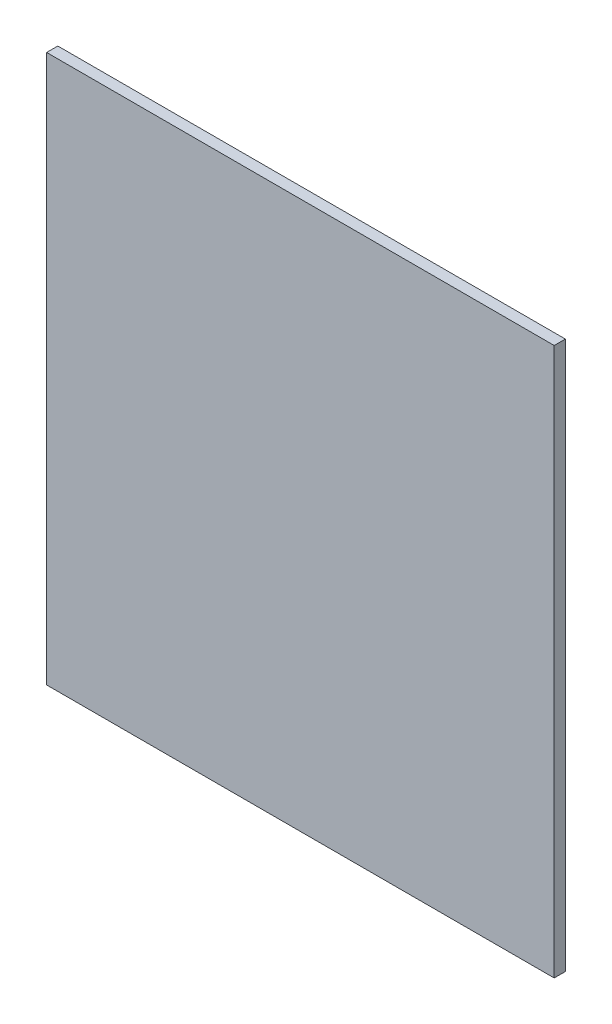
ISO-10303-21;
HEADER;
FILE_DESCRIPTION(('STEP AP214'),'2;1');
FILE_NAME('part.step','',(''),(''),'','','');
FILE_SCHEMA(('AUTOMOTIVE_DESIGN { 1 0 10303 214 1 1 1 1 }'));
ENDSEC;
DATA;
#1=APPLICATION_CONTEXT('core data for automotive mechanical design processes');
#2=APPLICATION_PROTOCOL_DEFINITION('international standard','automotive_design',2000,#1);
#3=PRODUCT_CONTEXT('',#1,'mechanical');
#4=PRODUCT('Part','Part','',(#3));
#5=PRODUCT_RELATED_PRODUCT_CATEGORY('part','',(#4));
#6=PRODUCT_DEFINITION_FORMATION('','',#4);
#7=PRODUCT_DEFINITION_CONTEXT('part definition',#1,'design');
#8=PRODUCT_DEFINITION('design','',#6,#7);
#9=PRODUCT_DEFINITION_SHAPE('','',#8);
#10=(LENGTH_UNIT() NAMED_UNIT(*) SI_UNIT(.MILLI.,.METRE.));
#11=(NAMED_UNIT(*) PLANE_ANGLE_UNIT() SI_UNIT($,.RADIAN.));
#12=(NAMED_UNIT(*) SI_UNIT($,.STERADIAN.) SOLID_ANGLE_UNIT());
#13=UNCERTAINTY_MEASURE_WITH_UNIT(LENGTH_MEASURE(1.E-05),#10,'distance_accuracy_value','');
#14=(GEOMETRIC_REPRESENTATION_CONTEXT(3) GLOBAL_UNCERTAINTY_ASSIGNED_CONTEXT((#13)) GLOBAL_UNIT_ASSIGNED_CONTEXT((#10,
#11,#12)) REPRESENTATION_CONTEXT('',''));
#15=CARTESIAN_POINT('',(0.,0.,0.));
#16=DIRECTION('',(0.,0.,1.));
#17=DIRECTION('',(1.,0.,0.));
#18=AXIS2_PLACEMENT_3D('',#15,#16,#17);
#19=CARTESIAN_POINT('',(-23.,38.3,1.25));
#20=DIRECTION('',(1.,0.,0.));
#21=DIRECTION('',(0.,1.,0.));
#22=AXIS2_PLACEMENT_3D('',#19,#20,#21);
#23=PLANE('',#22);
#24=DIRECTION('',(0.,-1.,0.));
#25=VECTOR('',#24,1.);
#26=CARTESIAN_POINT('',(-23.,38.3,0.));
#27=LINE('',#26,#25);
#28=CARTESIAN_POINT('',(-23.,38.3,0.));
#29=VERTEX_POINT('',#28);
#30=CARTESIAN_POINT('',(-23.,-23.,0.));
#31=VERTEX_POINT('',#30);
#32=EDGE_CURVE('E111',#29,#31,#27,.T.);
#33=ORIENTED_EDGE('',*,*,#32,.T.);
#34=DIRECTION('',(0.,0.,-1.));
#35=VECTOR('',#34,1.);
#36=CARTESIAN_POINT('',(-23.,-23.,1.25));
#37=LINE('',#36,#35);
#38=CARTESIAN_POINT('',(-23.,-23.,1.25));
#39=VERTEX_POINT('',#38);
#40=EDGE_CURVE('E11',#39,#31,#37,.T.);
#41=ORIENTED_EDGE('',*,*,#40,.F.);
#42=DIRECTION('',(0.,-1.,0.));
#43=VECTOR('',#42,1.);
#44=CARTESIAN_POINT('',(-23.,38.3,1.25));
#45=LINE('',#44,#43);
#46=CARTESIAN_POINT('',(-23.,38.3,1.25));
#47=VERTEX_POINT('',#46);
#48=EDGE_CURVE('E95',#47,#39,#45,.T.);
#49=ORIENTED_EDGE('',*,*,#48,.F.);
#50=DIRECTION('',(0.,0.,-1.));
#51=VECTOR('',#50,1.);
#52=CARTESIAN_POINT('',(-23.,38.3,1.25));
#53=LINE('',#52,#51);
#54=EDGE_CURVE('E107',#47,#29,#53,.T.);
#55=ORIENTED_EDGE('',*,*,#54,.T.);
#56=EDGE_LOOP('',(#33,#41,#49,#55));
#57=FACE_BOUND('',#56,.T.);
#58=ADVANCED_FACE('F43',(#57),#23,.F.);
#59=CARTESIAN_POINT('',(-23.,-23.,1.25));
#60=DIRECTION('',(0.,1.,0.));
#61=DIRECTION('',(0.,0.,1.));
#62=AXIS2_PLACEMENT_3D('',#59,#60,#61);
#63=PLANE('',#62);
#64=DIRECTION('',(1.,0.,0.));
#65=VECTOR('',#64,1.);
#66=CARTESIAN_POINT('',(-23.,-23.,0.));
#67=LINE('',#66,#65);
#68=CARTESIAN_POINT('',(33.8,-23.,0.));
#69=VERTEX_POINT('',#68);
#70=EDGE_CURVE('E100',#31,#69,#67,.T.);
#71=ORIENTED_EDGE('',*,*,#70,.T.);
#72=DIRECTION('',(0.,0.,-1.));
#73=VECTOR('',#72,1.);
#74=CARTESIAN_POINT('',(33.8,-23.,1.25));
#75=LINE('',#74,#73);
#76=CARTESIAN_POINT('',(33.8,-23.,1.25));
#77=VERTEX_POINT('',#76);
#78=EDGE_CURVE('E52',#77,#69,#75,.T.);
#79=ORIENTED_EDGE('',*,*,#78,.F.);
#80=DIRECTION('',(1.,0.,0.));
#81=VECTOR('',#80,1.);
#82=CARTESIAN_POINT('',(-23.,-23.,1.25));
#83=LINE('',#82,#81);
#84=EDGE_CURVE('E90',#39,#77,#83,.T.);
#85=ORIENTED_EDGE('',*,*,#84,.F.);
#86=ORIENTED_EDGE('',*,*,#40,.T.);
#87=EDGE_LOOP('',(#71,#79,#85,#86));
#88=FACE_BOUND('',#87,.T.);
#89=ADVANCED_FACE('F99',(#88),#63,.F.);
#90=CARTESIAN_POINT('',(33.8,38.3,1.25));
#91=DIRECTION('',(-1.,0.,0.));
#92=DIRECTION('',(0.,-1.,0.));
#93=AXIS2_PLACEMENT_3D('',#90,#91,#92);
#94=PLANE('',#93);
#95=DIRECTION('',(0.,1.,0.));
#96=VECTOR('',#95,1.);
#97=CARTESIAN_POINT('',(33.8,38.3,0.));
#98=LINE('',#97,#96);
#99=CARTESIAN_POINT('',(33.8,38.3,0.));
#100=VERTEX_POINT('',#99);
#101=EDGE_CURVE('E77',#69,#100,#98,.T.);
#102=ORIENTED_EDGE('',*,*,#101,.T.);
#103=DIRECTION('',(0.,0.,-1.));
#104=VECTOR('',#103,1.);
#105=CARTESIAN_POINT('',(33.8,38.3,1.25));
#106=LINE('',#105,#104);
#107=CARTESIAN_POINT('',(33.8,38.3,1.25));
#108=VERTEX_POINT('',#107);
#109=EDGE_CURVE('E102',#108,#100,#106,.T.);
#110=ORIENTED_EDGE('',*,*,#109,.F.);
#111=DIRECTION('',(0.,1.,0.));
#112=VECTOR('',#111,1.);
#113=CARTESIAN_POINT('',(33.8,38.3,1.25));
#114=LINE('',#113,#112);
#115=EDGE_CURVE('E93',#77,#108,#114,.T.);
#116=ORIENTED_EDGE('',*,*,#115,.F.);
#117=ORIENTED_EDGE('',*,*,#78,.T.);
#118=EDGE_LOOP('',(#102,#110,#116,#117));
#119=FACE_BOUND('',#118,.T.);
#120=ADVANCED_FACE('F103',(#119),#94,.F.);
#121=CARTESIAN_POINT('',(-23.,38.3,1.25));
#122=DIRECTION('',(0.,-1.,0.));
#123=DIRECTION('',(0.,0.,-1.));
#124=AXIS2_PLACEMENT_3D('',#121,#122,#123);
#125=PLANE('',#124);
#126=DIRECTION('',(-1.,0.,0.));
#127=VECTOR('',#126,1.);
#128=CARTESIAN_POINT('',(-23.,38.3,0.));
#129=LINE('',#128,#127);
#130=EDGE_CURVE('E83',#100,#29,#129,.T.);
#131=ORIENTED_EDGE('',*,*,#130,.T.);
#132=ORIENTED_EDGE('',*,*,#54,.F.);
#133=DIRECTION('',(-1.,0.,0.));
#134=VECTOR('',#133,1.);
#135=CARTESIAN_POINT('',(-23.,38.3,1.25));
#136=LINE('',#135,#134);
#137=EDGE_CURVE('E60',#108,#47,#136,.T.);
#138=ORIENTED_EDGE('',*,*,#137,.F.);
#139=ORIENTED_EDGE('',*,*,#109,.T.);
#140=EDGE_LOOP('',(#131,#132,#138,#139));
#141=FACE_BOUND('',#140,.T.);
#142=ADVANCED_FACE('F124',(#141),#125,.F.);
#143=CARTESIAN_POINT('',(0.,0.,1.25));
#144=DIRECTION('',(0.,0.,1.));
#145=DIRECTION('',(1.,0.,0.));
#146=AXIS2_PLACEMENT_3D('',#143,#144,#145);
#147=PLANE('',#146);
#148=ORIENTED_EDGE('',*,*,#48,.T.);
#149=ORIENTED_EDGE('',*,*,#84,.T.);
#150=ORIENTED_EDGE('',*,*,#115,.T.);
#151=ORIENTED_EDGE('',*,*,#137,.T.);
#152=EDGE_LOOP('',(#148,#149,#150,#151));
#153=FACE_BOUND('',#152,.T.);
#154=ADVANCED_FACE('F91',(#153),#147,.T.);
#155=CARTESIAN_POINT('',(0.,0.,0.));
#156=DIRECTION('',(0.,0.,1.));
#157=DIRECTION('',(1.,0.,0.));
#158=AXIS2_PLACEMENT_3D('',#155,#156,#157);
#159=PLANE('',#158);
#160=ORIENTED_EDGE('',*,*,#32,.F.);
#161=ORIENTED_EDGE('',*,*,#130,.F.);
#162=ORIENTED_EDGE('',*,*,#101,.F.);
#163=ORIENTED_EDGE('',*,*,#70,.F.);
#164=EDGE_LOOP('',(#160,#161,#162,#163));
#165=FACE_BOUND('',#164,.T.);
#166=ADVANCED_FACE('F127',(#165),#159,.F.);
#167=CLOSED_SHELL('',(#58,#89,#120,#142,#154,#166));
#168=MANIFOLD_SOLID_BREP('B2',#167);
#169=ADVANCED_BREP_SHAPE_REPRESENTATION('',(#18,#168),#14);
#170=SHAPE_DEFINITION_REPRESENTATION(#9,#169);
ENDSEC;
END-ISO-10303-21;
